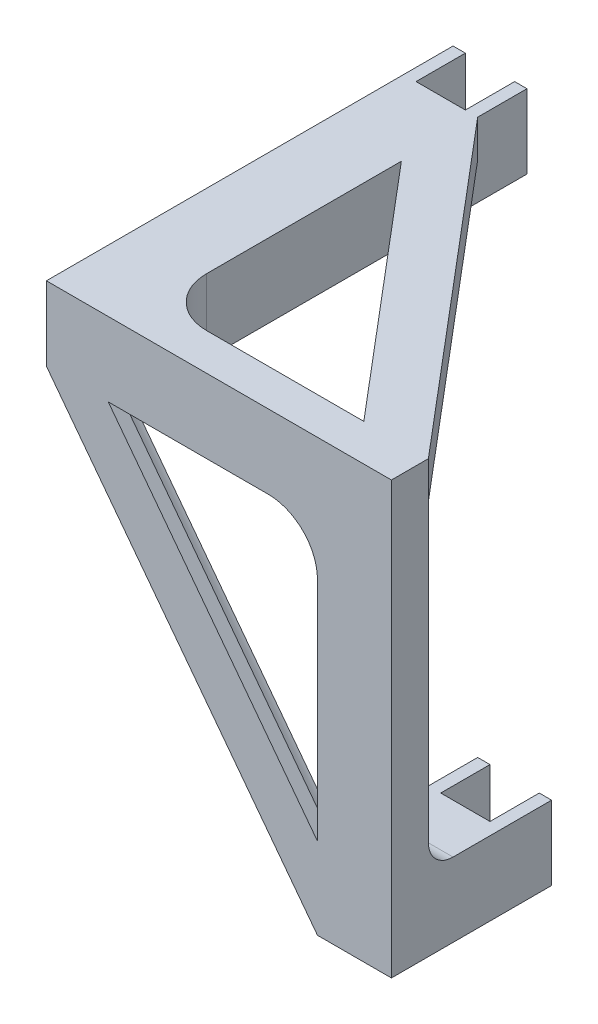
ISO-10303-21;
HEADER;
FILE_DESCRIPTION(('STEP AP214'),'2;1');
FILE_NAME('part.step','',(''),(''),'','','');
FILE_SCHEMA(('AUTOMOTIVE_DESIGN { 1 0 10303 214 1 1 1 1 }'));
ENDSEC;
DATA;
#1=APPLICATION_CONTEXT('core data for automotive mechanical design processes');
#2=APPLICATION_PROTOCOL_DEFINITION('international standard','automotive_design',2000,#1);
#3=PRODUCT_CONTEXT('',#1,'mechanical');
#4=PRODUCT('Part','Part','',(#3));
#5=PRODUCT_RELATED_PRODUCT_CATEGORY('part','',(#4));
#6=PRODUCT_DEFINITION_FORMATION('','',#4);
#7=PRODUCT_DEFINITION_CONTEXT('part definition',#1,'design');
#8=PRODUCT_DEFINITION('design','',#6,#7);
#9=PRODUCT_DEFINITION_SHAPE('','',#8);
#10=(LENGTH_UNIT() NAMED_UNIT(*) SI_UNIT(.MILLI.,.METRE.));
#11=(NAMED_UNIT(*) PLANE_ANGLE_UNIT() SI_UNIT($,.RADIAN.));
#12=(NAMED_UNIT(*) SI_UNIT($,.STERADIAN.) SOLID_ANGLE_UNIT());
#13=UNCERTAINTY_MEASURE_WITH_UNIT(LENGTH_MEASURE(1.E-05),#10,'distance_accuracy_value','');
#14=(GEOMETRIC_REPRESENTATION_CONTEXT(3) GLOBAL_UNCERTAINTY_ASSIGNED_CONTEXT((#13)) GLOBAL_UNIT_ASSIGNED_CONTEXT((#10,
#11,#12)) REPRESENTATION_CONTEXT('',''));
#15=CARTESIAN_POINT('',(0.,0.,0.));
#16=DIRECTION('',(0.,0.,1.));
#17=DIRECTION('',(1.,0.,0.));
#18=AXIS2_PLACEMENT_3D('',#15,#16,#17);
#19=CARTESIAN_POINT('',(-70.,57.5,0.));
#20=DIRECTION('',(0.,1.,0.));
#21=DIRECTION('',(0.,0.,1.));
#22=AXIS2_PLACEMENT_3D('',#19,#20,#21);
#23=PLANE('',#22);
#24=DIRECTION('',(-1.,0.,0.));
#25=VECTOR('',#24,1.);
#26=CARTESIAN_POINT('',(40.,57.5,165.));
#27=LINE('',#26,#25);
#28=CARTESIAN_POINT('',(20.,57.5,165.));
#29=VERTEX_POINT('',#28);
#30=CARTESIAN_POINT('',(-20.,57.5,165.));
#31=VERTEX_POINT('',#30);
#32=EDGE_CURVE('E299',#29,#31,#27,.T.);
#33=ORIENTED_EDGE('',*,*,#32,.F.);
#34=DIRECTION('',(0.,0.,1.));
#35=VECTOR('',#34,1.);
#36=CARTESIAN_POINT('',(20.,57.5,180.));
#37=LINE('',#36,#35);
#38=CARTESIAN_POINT('',(20.,57.5,180.));
#39=VERTEX_POINT('',#38);
#40=EDGE_CURVE('E268',#29,#39,#37,.T.);
#41=ORIENTED_EDGE('',*,*,#40,.T.);
#42=DIRECTION('',(-1.,0.,0.));
#43=VECTOR('',#42,1.);
#44=CARTESIAN_POINT('',(0.,57.5,180.));
#45=LINE('',#44,#43);
#46=CARTESIAN_POINT('',(-44.8961727955844,57.5,180.));
#47=VERTEX_POINT('',#46);
#48=EDGE_CURVE('E489',#39,#47,#45,.T.);
#49=ORIENTED_EDGE('',*,*,#48,.T.);
#50=DIRECTION('',(0.,0.,-1.));
#51=VECTOR('',#50,1.);
#52=CARTESIAN_POINT('',(-44.8961727955844,57.5,227.));
#53=LINE('',#52,#51);
#54=CARTESIAN_POINT('',(-44.8961727955844,57.5,175.));
#55=VERTEX_POINT('',#54);
#56=EDGE_CURVE('E518',#47,#55,#53,.T.);
#57=ORIENTED_EDGE('',*,*,#56,.T.);
#58=CARTESIAN_POINT('',(-44.8961727955844,57.5,165.));
#59=DIRECTION('',(0.,1.,0.));
#60=DIRECTION('',(-1.,0.,0.));
#61=AXIS2_PLACEMENT_3D('',#58,#59,#60);
#62=ELLIPSE('',#61,12.5519136022078,10.);
#63=CARTESIAN_POINT('',(-57.4480863977922,57.5,165.));
#64=VERTEX_POINT('',#63);
#65=EDGE_CURVE('E263',#55,#64,#62,.F.);
#66=ORIENTED_EDGE('',*,*,#65,.T.);
#67=DIRECTION('',(1.,0.,0.));
#68=VECTOR('',#67,1.);
#69=CARTESIAN_POINT('',(-70.,57.5,165.));
#70=LINE('',#69,#68);
#71=CARTESIAN_POINT('',(-70.,57.5,165.));
#72=VERTEX_POINT('',#71);
#73=EDGE_CURVE('E402',#72,#64,#70,.T.);
#74=ORIENTED_EDGE('',*,*,#73,.F.);
#75=DIRECTION('',(0.,0.,1.));
#76=VECTOR('',#75,1.);
#77=CARTESIAN_POINT('',(-70.,57.5,0.));
#78=LINE('',#77,#76);
#79=CARTESIAN_POINT('',(-70.,57.5,15.));
#80=VERTEX_POINT('',#79);
#81=EDGE_CURVE('E366',#80,#72,#78,.T.);
#82=ORIENTED_EDGE('',*,*,#81,.F.);
#83=DIRECTION('',(-1.,0.,0.));
#84=VECTOR('',#83,1.);
#85=CARTESIAN_POINT('',(-40.,57.5,15.));
#86=LINE('',#85,#84);
#87=CARTESIAN_POINT('',(-65.,57.5,15.));
#88=VERTEX_POINT('',#87);
#89=EDGE_CURVE('E452',#88,#80,#86,.T.);
#90=ORIENTED_EDGE('',*,*,#89,.F.);
#91=DIRECTION('',(0.,0.,-1.));
#92=VECTOR('',#91,1.);
#93=CARTESIAN_POINT('',(-65.,57.5,35.));
#94=LINE('',#93,#92);
#95=CARTESIAN_POINT('',(-65.,57.5,35.));
#96=VERTEX_POINT('',#95);
#97=EDGE_CURVE('E433',#96,#88,#94,.T.);
#98=ORIENTED_EDGE('',*,*,#97,.F.);
#99=DIRECTION('',(-1.,0.,0.));
#100=VECTOR('',#99,1.);
#101=CARTESIAN_POINT('',(-45.,57.5,35.));
#102=LINE('',#101,#100);
#103=CARTESIAN_POINT('',(-45.,57.5,35.));
#104=VERTEX_POINT('',#103);
#105=EDGE_CURVE('E428',#104,#96,#102,.T.);
#106=ORIENTED_EDGE('',*,*,#105,.F.);
#107=DIRECTION('',(0.,0.,-1.));
#108=VECTOR('',#107,1.);
#109=CARTESIAN_POINT('',(-45.,57.5,35.));
#110=LINE('',#109,#108);
#111=CARTESIAN_POINT('',(-45.,57.5,15.));
#112=VERTEX_POINT('',#111);
#113=EDGE_CURVE('E431',#104,#112,#110,.T.);
#114=ORIENTED_EDGE('',*,*,#113,.T.);
#115=CARTESIAN_POINT('',(-40.,57.5,15.));
#116=VERTEX_POINT('',#115);
#117=EDGE_CURVE('E304',#116,#112,#86,.T.);
#118=ORIENTED_EDGE('',*,*,#117,.F.);
#119=DIRECTION('',(0.,0.,-1.));
#120=VECTOR('',#119,1.);
#121=CARTESIAN_POINT('',(-40.,57.5,0.));
#122=LINE('',#121,#120);
#123=CARTESIAN_POINT('',(-40.,57.5,145.));
#124=VERTEX_POINT('',#123);
#125=EDGE_CURVE('E351',#124,#116,#122,.T.);
#126=ORIENTED_EDGE('',*,*,#125,.F.);
#127=CARTESIAN_POINT('',(-20.,57.5,145.));
#128=DIRECTION('',(0.,1.,0.));
#129=DIRECTION('',(0.,0.,1.));
#130=AXIS2_PLACEMENT_3D('',#127,#128,#129);
#131=CIRCLE('',#130,20.);
#132=EDGE_CURVE('E284',#124,#31,#131,.T.);
#133=ORIENTED_EDGE('',*,*,#132,.T.);
#134=EDGE_LOOP('',(#33,#41,#49,#57,#66,#74,#82,#90,#98,#106,#114,#118,#126,#133));
#135=FACE_BOUND('',#134,.T.);
#136=ADVANCED_FACE('F34',(#135),#23,.F.);
#137=CARTESIAN_POINT('',(40.,-87.5,0.));
#138=DIRECTION('',(1.,0.,0.));
#139=DIRECTION('',(0.,0.,-1.));
#140=AXIS2_PLACEMENT_3D('',#137,#138,#139);
#141=PLANE('',#140);
#142=DIRECTION('',(0.,1.,0.));
#143=VECTOR('',#142,1.);
#144=CARTESIAN_POINT('',(40.,0.,180.));
#145=LINE('',#144,#143);
#146=CARTESIAN_POINT('',(40.,-54.4085914123613,180.));
#147=VERTEX_POINT('',#146);
#148=CARTESIAN_POINT('',(40.,37.5,180.));
#149=VERTEX_POINT('',#148);
#150=EDGE_CURVE('E502',#147,#149,#145,.T.);
#151=ORIENTED_EDGE('',*,*,#150,.T.);
#152=DIRECTION('',(0.,0.,1.));
#153=VECTOR('',#152,1.);
#154=CARTESIAN_POINT('',(40.,37.5,165.));
#155=LINE('',#154,#153);
#156=CARTESIAN_POINT('',(40.,37.5,165.));
#157=VERTEX_POINT('',#156);
#158=EDGE_CURVE('E271',#149,#157,#155,.F.);
#159=ORIENTED_EDGE('',*,*,#158,.T.);
#160=DIRECTION('',(0.,1.,0.));
#161=VECTOR('',#160,1.);
#162=CARTESIAN_POINT('',(40.,-57.5,165.));
#163=LINE('',#162,#161);
#164=CARTESIAN_POINT('',(40.,-47.5,165.));
#165=VERTEX_POINT('',#164);
#166=EDGE_CURVE('E290',#165,#157,#163,.T.);
#167=ORIENTED_EDGE('',*,*,#166,.F.);
#168=CARTESIAN_POINT('',(40.,-47.5,155.));
#169=DIRECTION('',(1.,0.,0.));
#170=DIRECTION('',(0.,0.,-1.));
#171=AXIS2_PLACEMENT_3D('',#168,#169,#170);
#172=CIRCLE('',#171,10.);
#173=CARTESIAN_POINT('',(40.,-57.5,155.));
#174=VERTEX_POINT('',#173);
#175=EDGE_CURVE('E42',#165,#174,#172,.T.);
#176=ORIENTED_EDGE('',*,*,#175,.T.);
#177=DIRECTION('',(0.,0.,1.));
#178=VECTOR('',#177,1.);
#179=CARTESIAN_POINT('',(40.,-57.5,115.));
#180=LINE('',#179,#178);
#181=CARTESIAN_POINT('',(40.,-57.5,115.));
#182=VERTEX_POINT('',#181);
#183=EDGE_CURVE('E323',#182,#174,#180,.T.);
#184=ORIENTED_EDGE('',*,*,#183,.F.);
#185=DIRECTION('',(0.,1.,0.));
#186=VECTOR('',#185,1.);
#187=CARTESIAN_POINT('',(40.,57.5,115.));
#188=LINE('',#187,#186);
#189=CARTESIAN_POINT('',(40.,-87.5,115.));
#190=VERTEX_POINT('',#189);
#191=EDGE_CURVE('E355',#190,#182,#188,.T.);
#192=ORIENTED_EDGE('',*,*,#191,.F.);
#193=DIRECTION('',(0.,0.,1.));
#194=VECTOR('',#193,1.);
#195=CARTESIAN_POINT('',(40.,-87.5,0.));
#196=LINE('',#195,#194);
#197=CARTESIAN_POINT('',(40.,-87.5,165.));
#198=VERTEX_POINT('',#197);
#199=EDGE_CURVE('E365',#190,#198,#196,.T.);
#200=ORIENTED_EDGE('',*,*,#199,.T.);
#201=DIRECTION('',(0.,-1.,0.));
#202=VECTOR('',#201,1.);
#203=CARTESIAN_POINT('',(40.,-87.5,165.));
#204=LINE('',#203,#202);
#205=CARTESIAN_POINT('',(40.,-70.9542957061806,165.));
#206=VERTEX_POINT('',#205);
#207=EDGE_CURVE('E250',#206,#198,#204,.T.);
#208=ORIENTED_EDGE('',*,*,#207,.F.);
#209=CARTESIAN_POINT('',(40.,-54.4085914123613,165.));
#210=DIRECTION('',(1.,0.,0.));
#211=DIRECTION('',(0.,1.,0.));
#212=AXIS2_PLACEMENT_3D('',#209,#210,#211);
#213=ELLIPSE('',#212,16.5457042938194,10.);
#214=CARTESIAN_POINT('',(40.,-54.4085914123613,175.));
#215=VERTEX_POINT('',#214);
#216=EDGE_CURVE('E265',#206,#215,#213,.F.);
#217=ORIENTED_EDGE('',*,*,#216,.T.);
#218=DIRECTION('',(0.,0.,-1.));
#219=VECTOR('',#218,1.);
#220=CARTESIAN_POINT('',(40.,-54.4085914123613,227.));
#221=LINE('',#220,#219);
#222=EDGE_CURVE('E522',#147,#215,#221,.T.);
#223=ORIENTED_EDGE('',*,*,#222,.F.);
#224=EDGE_LOOP('',(#151,#159,#167,#176,#184,#192,#200,#208,#217,#223));
#225=FACE_BOUND('',#224,.T.);
#226=ADVANCED_FACE('F296',(#225),#141,.F.);
#227=CARTESIAN_POINT('',(0.,0.,165.));
#228=DIRECTION('',(0.,0.,-1.));
#229=DIRECTION('',(-1.,0.,0.));
#230=AXIS2_PLACEMENT_3D('',#227,#228,#229);
#231=PLANE('',#230);
#232=DIRECTION('',(0.,-1.,0.));
#233=VECTOR('',#232,1.);
#234=CARTESIAN_POINT('',(70.,87.5,165.));
#235=LINE('',#234,#233);
#236=CARTESIAN_POINT('',(70.,72.5,165.));
#237=VERTEX_POINT('',#236);
#238=CARTESIAN_POINT('',(70.,-47.5,165.));
#239=VERTEX_POINT('',#238);
#240=EDGE_CURVE('E292',#237,#239,#235,.T.);
#241=ORIENTED_EDGE('',*,*,#240,.T.);
#242=DIRECTION('',(-1.,0.,0.));
#243=VECTOR('',#242,1.);
#244=CARTESIAN_POINT('',(0.,-47.5,165.));
#245=LINE('',#244,#243);
#246=EDGE_CURVE('E286',#239,#165,#245,.T.);
#247=ORIENTED_EDGE('',*,*,#246,.T.);
#248=ORIENTED_EDGE('',*,*,#166,.T.);
#249=CARTESIAN_POINT('',(20.,37.5,165.));
#250=DIRECTION('',(0.,0.,-1.));
#251=DIRECTION('',(-1.,0.,0.));
#252=AXIS2_PLACEMENT_3D('',#249,#250,#251);
#253=CIRCLE('',#252,20.);
#254=EDGE_CURVE('E280',#157,#29,#253,.F.);
#255=ORIENTED_EDGE('',*,*,#254,.T.);
#256=ORIENTED_EDGE('',*,*,#32,.T.);
#257=DIRECTION('',(0.,1.,0.));
#258=VECTOR('',#257,1.);
#259=CARTESIAN_POINT('',(-20.,0.,165.));
#260=LINE('',#259,#258);
#261=CARTESIAN_POINT('',(-20.,87.5,165.));
#262=VERTEX_POINT('',#261);
#263=EDGE_CURVE('E274',#31,#262,#260,.T.);
#264=ORIENTED_EDGE('',*,*,#263,.T.);
#265=DIRECTION('',(-1.,0.,0.));
#266=VECTOR('',#265,1.);
#267=CARTESIAN_POINT('',(-70.,87.5,165.));
#268=LINE('',#267,#266);
#269=CARTESIAN_POINT('',(43.800944052421,87.5,165.));
#270=VERTEX_POINT('',#269);
#271=EDGE_CURVE('E236',#270,#262,#268,.T.);
#272=ORIENTED_EDGE('',*,*,#271,.F.);
#273=DIRECTION('',(0.,-1.,0.));
#274=VECTOR('',#273,1.);
#275=CARTESIAN_POINT('',(43.800944052421,134.5,165.));
#276=LINE('',#275,#274);
#277=CARTESIAN_POINT('',(43.800944052421,82.5,165.));
#278=VERTEX_POINT('',#277);
#279=EDGE_CURVE('E226',#270,#278,#276,.T.);
#280=ORIENTED_EDGE('',*,*,#279,.T.);
#281=CARTESIAN_POINT('',(43.8009440524209,72.5,165.));
#282=DIRECTION('',(0.,0.,-1.));
#283=DIRECTION('',(1.,0.,0.));
#284=AXIS2_PLACEMENT_3D('',#281,#282,#283);
#285=ELLIPSE('',#284,13.0995279737895,10.);
#286=CARTESIAN_POINT('',(56.9004720262105,72.5,165.));
#287=VERTEX_POINT('',#286);
#288=EDGE_CURVE('E232',#278,#287,#285,.T.);
#289=ORIENTED_EDGE('',*,*,#288,.T.);
#290=DIRECTION('',(1.,0.,0.));
#291=VECTOR('',#290,1.);
#292=CARTESIAN_POINT('',(0.,72.5,165.));
#293=LINE('',#292,#291);
#294=EDGE_CURVE('E510',#287,#237,#293,.T.);
#295=ORIENTED_EDGE('',*,*,#294,.T.);
#296=EDGE_LOOP('',(#241,#247,#248,#255,#256,#264,#272,#280,#289,#295));
#297=FACE_BOUND('',#296,.T.);
#298=ADVANCED_FACE('F229',(#297),#231,.T.);
#299=CARTESIAN_POINT('',(0.,0.,15.));
#300=DIRECTION('',(0.,0.,-1.));
#301=DIRECTION('',(-1.,0.,0.));
#302=AXIS2_PLACEMENT_3D('',#299,#300,#301);
#303=PLANE('',#302);
#304=DIRECTION('',(0.,1.,0.));
#305=VECTOR('',#304,1.);
#306=CARTESIAN_POINT('',(-65.,117.5,15.));
#307=LINE('',#306,#305);
#308=CARTESIAN_POINT('',(-65.,87.5,15.));
#309=VERTEX_POINT('',#308);
#310=EDGE_CURVE('E422',#88,#309,#307,.T.);
#311=ORIENTED_EDGE('',*,*,#310,.F.);
#312=ORIENTED_EDGE('',*,*,#89,.T.);
#313=DIRECTION('',(0.,1.,0.));
#314=VECTOR('',#313,1.);
#315=CARTESIAN_POINT('',(-70.,57.5,15.));
#316=LINE('',#315,#314);
#317=CARTESIAN_POINT('',(-70.,87.5,15.));
#318=VERTEX_POINT('',#317);
#319=EDGE_CURVE('E445',#80,#318,#316,.T.);
#320=ORIENTED_EDGE('',*,*,#319,.T.);
#321=DIRECTION('',(1.,0.,0.));
#322=VECTOR('',#321,1.);
#323=CARTESIAN_POINT('',(-70.,87.5,15.));
#324=LINE('',#323,#322);
#325=EDGE_CURVE('E448',#318,#309,#324,.T.);
#326=ORIENTED_EDGE('',*,*,#325,.T.);
#327=EDGE_LOOP('',(#311,#312,#320,#326));
#328=FACE_BOUND('',#327,.T.);
#329=ADVANCED_FACE('F563',(#328),#303,.T.);
#330=CARTESIAN_POINT('',(-70.,87.5,150.));
#331=DIRECTION('',(0.,-1.,0.));
#332=DIRECTION('',(0.,0.,-1.));
#333=AXIS2_PLACEMENT_3D('',#330,#331,#332);
#334=PLANE('',#333);
#335=DIRECTION('',(0.645942241466174,0.,0.763386285369115));
#336=VECTOR('',#335,1.);
#337=CARTESIAN_POINT('',(-11.0780705349685,87.5,100.142982760358));
#338=LINE('',#337,#336);
#339=CARTESIAN_POINT('',(-40.,87.5,65.9625206653207));
#340=VERTEX_POINT('',#339);
#341=EDGE_CURVE('E529',#340,#270,#338,.T.);
#342=ORIENTED_EDGE('',*,*,#341,.T.);
#343=ORIENTED_EDGE('',*,*,#271,.T.);
#344=CARTESIAN_POINT('',(-20.,87.5,145.));
#345=DIRECTION('',(0.,-1.,0.));
#346=DIRECTION('',(0.,0.,-1.));
#347=AXIS2_PLACEMENT_3D('',#344,#345,#346);
#348=CIRCLE('',#347,20.);
#349=CARTESIAN_POINT('',(-40.,87.5,145.));
#350=VERTEX_POINT('',#349);
#351=EDGE_CURVE('E282',#262,#350,#348,.T.);
#352=ORIENTED_EDGE('',*,*,#351,.T.);
#353=DIRECTION('',(0.,0.,-1.));
#354=VECTOR('',#353,1.);
#355=CARTESIAN_POINT('',(-40.,87.5,150.));
#356=LINE('',#355,#354);
#357=EDGE_CURVE('E240',#350,#340,#356,.T.);
#358=ORIENTED_EDGE('',*,*,#357,.T.);
#359=EDGE_LOOP('',(#342,#343,#352,#358));
#360=FACE_BOUND('',#359,.T.);
#361=DIRECTION('',(-0.645942241466174,0.,-0.763386285369115));
#362=VECTOR('',#361,1.);
#363=CARTESIAN_POINT('',(-40.,87.5,35.));
#364=LINE('',#363,#362);
#365=CARTESIAN_POINT('',(70.,87.5,165.));
#366=VERTEX_POINT('',#365);
#367=CARTESIAN_POINT('',(-40.,87.5,35.));
#368=VERTEX_POINT('',#367);
#369=EDGE_CURVE('E410',#366,#368,#364,.T.);
#370=ORIENTED_EDGE('',*,*,#369,.T.);
#371=DIRECTION('',(0.,0.,-1.));
#372=VECTOR('',#371,1.);
#373=CARTESIAN_POINT('',(-40.,87.5,150.));
#374=LINE('',#373,#372);
#375=CARTESIAN_POINT('',(-40.,87.5,15.));
#376=VERTEX_POINT('',#375);
#377=EDGE_CURVE('E353',#368,#376,#374,.T.);
#378=ORIENTED_EDGE('',*,*,#377,.T.);
#379=CARTESIAN_POINT('',(-45.,87.5,15.));
#380=VERTEX_POINT('',#379);
#381=EDGE_CURVE('E447',#380,#376,#324,.T.);
#382=ORIENTED_EDGE('',*,*,#381,.F.);
#383=DIRECTION('',(0.,0.,1.));
#384=VECTOR('',#383,1.);
#385=CARTESIAN_POINT('',(-45.,87.5,150.));
#386=LINE('',#385,#384);
#387=CARTESIAN_POINT('',(-45.,87.5,35.));
#388=VERTEX_POINT('',#387);
#389=EDGE_CURVE('E435',#380,#388,#386,.T.);
#390=ORIENTED_EDGE('',*,*,#389,.T.);
#391=DIRECTION('',(1.,0.,0.));
#392=VECTOR('',#391,1.);
#393=CARTESIAN_POINT('',(-70.,87.5,35.));
#394=LINE('',#393,#392);
#395=CARTESIAN_POINT('',(-65.,87.5,35.));
#396=VERTEX_POINT('',#395);
#397=EDGE_CURVE('E443',#396,#388,#394,.T.);
#398=ORIENTED_EDGE('',*,*,#397,.F.);
#399=DIRECTION('',(0.,0.,-1.));
#400=VECTOR('',#399,1.);
#401=CARTESIAN_POINT('',(-65.,87.5,150.));
#402=LINE('',#401,#400);
#403=EDGE_CURVE('E440',#396,#309,#402,.T.);
#404=ORIENTED_EDGE('',*,*,#403,.T.);
#405=ORIENTED_EDGE('',*,*,#325,.F.);
#406=DIRECTION('',(0.,0.,-1.));
#407=VECTOR('',#406,1.);
#408=CARTESIAN_POINT('',(-70.,87.5,150.));
#409=LINE('',#408,#407);
#410=CARTESIAN_POINT('',(-70.,87.5,180.));
#411=VERTEX_POINT('',#410);
#412=EDGE_CURVE('E374',#411,#318,#409,.T.);
#413=ORIENTED_EDGE('',*,*,#412,.F.);
#414=DIRECTION('',(-1.,0.,0.));
#415=VECTOR('',#414,1.);
#416=CARTESIAN_POINT('',(70.,87.5,180.));
#417=LINE('',#416,#415);
#418=CARTESIAN_POINT('',(70.,87.5,180.));
#419=VERTEX_POINT('',#418);
#420=EDGE_CURVE('E320',#419,#411,#417,.T.);
#421=ORIENTED_EDGE('',*,*,#420,.F.);
#422=DIRECTION('',(0.,0.,-1.));
#423=VECTOR('',#422,1.);
#424=CARTESIAN_POINT('',(70.,87.5,150.));
#425=LINE('',#424,#423);
#426=EDGE_CURVE('E377',#419,#366,#425,.T.);
#427=ORIENTED_EDGE('',*,*,#426,.T.);
#428=EDGE_LOOP('',(#370,#378,#382,#390,#398,#404,#405,#413,#421,#427));
#429=FACE_BOUND('',#428,.T.);
#430=ADVANCED_FACE('F477',(#360,#429),#334,.F.);
#431=CARTESIAN_POINT('',(-70.,87.5,150.));
#432=DIRECTION('',(1.,0.,0.));
#433=DIRECTION('',(0.,1.,0.));
#434=AXIS2_PLACEMENT_3D('',#431,#432,#433);
#435=PLANE('',#434);
#436=ORIENTED_EDGE('',*,*,#319,.F.);
#437=ORIENTED_EDGE('',*,*,#81,.T.);
#438=DIRECTION('',(0.,0.,1.));
#439=VECTOR('',#438,1.);
#440=CARTESIAN_POINT('',(-70.,57.5,175.));
#441=LINE('',#440,#439);
#442=CARTESIAN_POINT('',(-70.,57.5,180.));
#443=VERTEX_POINT('',#442);
#444=EDGE_CURVE('E401',#72,#443,#441,.T.);
#445=ORIENTED_EDGE('',*,*,#444,.T.);
#446=DIRECTION('',(0.,-1.,0.));
#447=VECTOR('',#446,1.);
#448=CARTESIAN_POINT('',(-70.,87.5,180.));
#449=LINE('',#448,#447);
#450=EDGE_CURVE('E310',#411,#443,#449,.T.);
#451=ORIENTED_EDGE('',*,*,#450,.F.);
#452=ORIENTED_EDGE('',*,*,#412,.T.);
#453=EDGE_LOOP('',(#436,#437,#445,#451,#452));
#454=FACE_BOUND('',#453,.T.);
#455=ADVANCED_FACE('F515',(#454),#435,.F.);
#456=CARTESIAN_POINT('',(-40.,207.5,0.));
#457=DIRECTION('',(-1.,0.,0.));
#458=DIRECTION('',(0.,0.,1.));
#459=AXIS2_PLACEMENT_3D('',#456,#457,#458);
#460=PLANE('',#459);
#461=ORIENTED_EDGE('',*,*,#357,.F.);
#462=DIRECTION('',(0.,1.,0.));
#463=VECTOR('',#462,1.);
#464=CARTESIAN_POINT('',(-40.,207.5,145.));
#465=LINE('',#464,#463);
#466=EDGE_CURVE('E276',#350,#124,#465,.F.);
#467=ORIENTED_EDGE('',*,*,#466,.T.);
#468=ORIENTED_EDGE('',*,*,#125,.T.);
#469=DIRECTION('',(0.,-1.,0.));
#470=VECTOR('',#469,1.);
#471=CARTESIAN_POINT('',(-40.,87.5,15.));
#472=LINE('',#471,#470);
#473=EDGE_CURVE('E450',#376,#116,#472,.T.);
#474=ORIENTED_EDGE('',*,*,#473,.F.);
#475=ORIENTED_EDGE('',*,*,#377,.F.);
#476=DIRECTION('',(0.,1.,0.));
#477=VECTOR('',#476,1.);
#478=CARTESIAN_POINT('',(-40.,82.5,35.));
#479=LINE('',#478,#477);
#480=CARTESIAN_POINT('',(-40.,72.5,35.));
#481=VERTEX_POINT('',#480);
#482=EDGE_CURVE('E413',#481,#368,#479,.T.);
#483=ORIENTED_EDGE('',*,*,#482,.F.);
#484=DIRECTION('',(0.,0.,-1.));
#485=VECTOR('',#484,1.);
#486=CARTESIAN_POINT('',(-40.,72.5,0.));
#487=LINE('',#486,#485);
#488=CARTESIAN_POINT('',(-40.,72.5,50.4812603326604));
#489=VERTEX_POINT('',#488);
#490=EDGE_CURVE('E507',#489,#481,#487,.T.);
#491=ORIENTED_EDGE('',*,*,#490,.F.);
#492=CARTESIAN_POINT('',(-40.,72.5,65.9625206653207));
#493=DIRECTION('',(-1.,0.,0.));
#494=DIRECTION('',(0.,0.,1.));
#495=AXIS2_PLACEMENT_3D('',#492,#493,#494);
#496=ELLIPSE('',#495,15.4812603326604,10.);
#497=CARTESIAN_POINT('',(-40.,82.5,65.9625206653207));
#498=VERTEX_POINT('',#497);
#499=EDGE_CURVE('E255',#489,#498,#496,.F.);
#500=ORIENTED_EDGE('',*,*,#499,.T.);
#501=DIRECTION('',(0.,-1.,0.));
#502=VECTOR('',#501,1.);
#503=CARTESIAN_POINT('',(-40.,134.5,65.9625206653207));
#504=LINE('',#503,#502);
#505=EDGE_CURVE('E241',#340,#498,#504,.T.);
#506=ORIENTED_EDGE('',*,*,#505,.F.);
#507=EDGE_LOOP('',(#461,#467,#468,#474,#475,#483,#491,#500,#506));
#508=FACE_BOUND('',#507,.T.);
#509=ADVANCED_FACE('F480',(#508),#460,.F.);
#510=CARTESIAN_POINT('',(190.,57.5,115.));
#511=DIRECTION('',(0.,0.,1.));
#512=DIRECTION('',(0.,-1.,0.));
#513=AXIS2_PLACEMENT_3D('',#510,#511,#512);
#514=PLANE('',#513);
#515=ORIENTED_EDGE('',*,*,#191,.T.);
#516=DIRECTION('',(-1.,0.,0.));
#517=VECTOR('',#516,1.);
#518=CARTESIAN_POINT('',(190.,-57.5,115.));
#519=LINE('',#518,#517);
#520=CARTESIAN_POINT('',(45.,-57.5,115.));
#521=VERTEX_POINT('',#520);
#522=EDGE_CURVE('E325',#521,#182,#519,.T.);
#523=ORIENTED_EDGE('',*,*,#522,.F.);
#524=DIRECTION('',(0.,-1.,0.));
#525=VECTOR('',#524,1.);
#526=CARTESIAN_POINT('',(45.,57.5,115.));
#527=LINE('',#526,#525);
#528=CARTESIAN_POINT('',(45.,-87.5,115.));
#529=VERTEX_POINT('',#528);
#530=EDGE_CURVE('E349',#521,#529,#527,.T.);
#531=ORIENTED_EDGE('',*,*,#530,.T.);
#532=DIRECTION('',(-1.,0.,0.));
#533=VECTOR('',#532,1.);
#534=CARTESIAN_POINT('',(190.,-87.5,115.));
#535=LINE('',#534,#533);
#536=EDGE_CURVE('E358',#529,#190,#535,.T.);
#537=ORIENTED_EDGE('',*,*,#536,.T.);
#538=EDGE_LOOP('',(#515,#523,#531,#537));
#539=FACE_BOUND('',#538,.T.);
#540=ADVANCED_FACE('F566',(#539),#514,.F.);
#541=CARTESIAN_POINT('',(70.,87.5,150.));
#542=DIRECTION('',(-1.,0.,0.));
#543=DIRECTION('',(0.,-1.,0.));
#544=AXIS2_PLACEMENT_3D('',#541,#542,#543);
#545=PLANE('',#544);
#546=DIRECTION('',(0.,0.,1.));
#547=VECTOR('',#546,1.);
#548=CARTESIAN_POINT('',(70.,-57.5,150.));
#549=LINE('',#548,#547);
#550=CARTESIAN_POINT('',(70.,-57.5,115.));
#551=VERTEX_POINT('',#550);
#552=CARTESIAN_POINT('',(70.,-57.5,155.));
#553=VERTEX_POINT('',#552);
#554=EDGE_CURVE('E331',#551,#553,#549,.T.);
#555=ORIENTED_EDGE('',*,*,#554,.T.);
#556=CARTESIAN_POINT('',(70.,-47.5,155.));
#557=DIRECTION('',(-1.,0.,0.));
#558=DIRECTION('',(0.,-1.,0.));
#559=AXIS2_PLACEMENT_3D('',#556,#557,#558);
#560=CIRCLE('',#559,10.);
#561=EDGE_CURVE('E11',#553,#239,#560,.T.);
#562=ORIENTED_EDGE('',*,*,#561,.T.);
#563=ORIENTED_EDGE('',*,*,#240,.F.);
#564=EDGE_CURVE('E309',#366,#237,#235,.T.);
#565=ORIENTED_EDGE('',*,*,#564,.F.);
#566=ORIENTED_EDGE('',*,*,#426,.F.);
#567=DIRECTION('',(0.,1.,0.));
#568=VECTOR('',#567,1.);
#569=CARTESIAN_POINT('',(70.,-87.5,180.));
#570=LINE('',#569,#568);
#571=CARTESIAN_POINT('',(70.,-87.5,180.));
#572=VERTEX_POINT('',#571);
#573=EDGE_CURVE('E317',#572,#419,#570,.T.);
#574=ORIENTED_EDGE('',*,*,#573,.F.);
#575=DIRECTION('',(0.,0.,-1.));
#576=VECTOR('',#575,1.);
#577=CARTESIAN_POINT('',(70.,-87.5,150.));
#578=LINE('',#577,#576);
#579=CARTESIAN_POINT('',(70.,-87.5,115.));
#580=VERTEX_POINT('',#579);
#581=EDGE_CURVE('E369',#572,#580,#578,.T.);
#582=ORIENTED_EDGE('',*,*,#581,.T.);
#583=DIRECTION('',(0.,1.,0.));
#584=VECTOR('',#583,1.);
#585=CARTESIAN_POINT('',(70.,87.5,115.));
#586=LINE('',#585,#584);
#587=EDGE_CURVE('E362',#580,#551,#586,.T.);
#588=ORIENTED_EDGE('',*,*,#587,.T.);
#589=EDGE_LOOP('',(#555,#562,#563,#565,#566,#574,#582,#588));
#590=FACE_BOUND('',#589,.T.);
#591=ADVANCED_FACE('F542',(#590),#545,.F.);
#592=CARTESIAN_POINT('',(-70.,-87.5,150.));
#593=DIRECTION('',(0.,1.,0.));
#594=DIRECTION('',(0.,0.,1.));
#595=AXIS2_PLACEMENT_3D('',#592,#593,#594);
#596=PLANE('',#595);
#597=ORIENTED_EDGE('',*,*,#536,.F.);
#598=DIRECTION('',(0.,0.,-1.));
#599=VECTOR('',#598,1.);
#600=CARTESIAN_POINT('',(45.,-87.5,95.));
#601=LINE('',#600,#599);
#602=CARTESIAN_POINT('',(45.,-87.5,135.));
#603=VERTEX_POINT('',#602);
#604=EDGE_CURVE('E333',#603,#529,#601,.T.);
#605=ORIENTED_EDGE('',*,*,#604,.F.);
#606=DIRECTION('',(-1.,0.,0.));
#607=VECTOR('',#606,1.);
#608=CARTESIAN_POINT('',(65.,-87.5,135.));
#609=LINE('',#608,#607);
#610=CARTESIAN_POINT('',(65.,-87.5,135.));
#611=VERTEX_POINT('',#610);
#612=EDGE_CURVE('E339',#611,#603,#609,.T.);
#613=ORIENTED_EDGE('',*,*,#612,.F.);
#614=DIRECTION('',(0.,0.,1.));
#615=VECTOR('',#614,1.);
#616=CARTESIAN_POINT('',(65.,-87.5,95.));
#617=LINE('',#616,#615);
#618=CARTESIAN_POINT('',(65.,-87.5,115.));
#619=VERTEX_POINT('',#618);
#620=EDGE_CURVE('E336',#619,#611,#617,.T.);
#621=ORIENTED_EDGE('',*,*,#620,.F.);
#622=EDGE_CURVE('E359',#580,#619,#535,.T.);
#623=ORIENTED_EDGE('',*,*,#622,.F.);
#624=ORIENTED_EDGE('',*,*,#581,.F.);
#625=DIRECTION('',(1.,0.,0.));
#626=VECTOR('',#625,1.);
#627=CARTESIAN_POINT('',(40.,-87.5,180.));
#628=LINE('',#627,#626);
#629=CARTESIAN_POINT('',(40.,-87.5,180.));
#630=VERTEX_POINT('',#629);
#631=EDGE_CURVE('E314',#630,#572,#628,.T.);
#632=ORIENTED_EDGE('',*,*,#631,.F.);
#633=DIRECTION('',(0.,0.,1.));
#634=VECTOR('',#633,1.);
#635=CARTESIAN_POINT('',(40.,-87.5,175.));
#636=LINE('',#635,#634);
#637=EDGE_CURVE('E398',#198,#630,#636,.T.);
#638=ORIENTED_EDGE('',*,*,#637,.F.);
#639=ORIENTED_EDGE('',*,*,#199,.F.);
#640=EDGE_LOOP('',(#597,#605,#613,#621,#623,#624,#632,#638,#639));
#641=FACE_BOUND('',#640,.T.);
#642=ADVANCED_FACE('F408',(#641),#596,.F.);
#643=DIRECTION('',(0.,1.,0.));
#644=VECTOR('',#643,1.);
#645=CARTESIAN_POINT('',(65.,57.5,115.));
#646=LINE('',#645,#644);
#647=CARTESIAN_POINT('',(65.,-57.5,115.));
#648=VERTEX_POINT('',#647);
#649=EDGE_CURVE('E345',#619,#648,#646,.T.);
#650=ORIENTED_EDGE('',*,*,#649,.T.);
#651=EDGE_CURVE('E327',#551,#648,#519,.T.);
#652=ORIENTED_EDGE('',*,*,#651,.F.);
#653=ORIENTED_EDGE('',*,*,#587,.F.);
#654=ORIENTED_EDGE('',*,*,#622,.T.);
#655=EDGE_LOOP('',(#650,#652,#653,#654));
#656=FACE_BOUND('',#655,.T.);
#657=ADVANCED_FACE('F554',(#656),#514,.F.);
#658=CARTESIAN_POINT('',(70.,207.5,135.));
#659=DIRECTION('',(0.,0.,1.));
#660=DIRECTION('',(1.,0.,0.));
#661=AXIS2_PLACEMENT_3D('',#658,#659,#660);
#662=PLANE('',#661);
#663=DIRECTION('',(0.,-1.,0.));
#664=VECTOR('',#663,1.);
#665=CARTESIAN_POINT('',(45.,62.5,135.));
#666=LINE('',#665,#664);
#667=CARTESIAN_POINT('',(45.,-57.5,135.));
#668=VERTEX_POINT('',#667);
#669=EDGE_CURVE('E343',#668,#603,#666,.T.);
#670=ORIENTED_EDGE('',*,*,#669,.F.);
#671=DIRECTION('',(-1.,0.,0.));
#672=VECTOR('',#671,1.);
#673=CARTESIAN_POINT('',(65.,-57.5,135.));
#674=LINE('',#673,#672);
#675=CARTESIAN_POINT('',(65.,-57.5,135.));
#676=VERTEX_POINT('',#675);
#677=EDGE_CURVE('E300',#676,#668,#674,.T.);
#678=ORIENTED_EDGE('',*,*,#677,.F.);
#679=DIRECTION('',(0.,-1.,0.));
#680=VECTOR('',#679,1.);
#681=CARTESIAN_POINT('',(65.,62.5,135.));
#682=LINE('',#681,#680);
#683=EDGE_CURVE('E342',#676,#611,#682,.T.);
#684=ORIENTED_EDGE('',*,*,#683,.T.);
#685=ORIENTED_EDGE('',*,*,#612,.T.);
#686=EDGE_LOOP('',(#670,#678,#684,#685));
#687=FACE_BOUND('',#686,.T.);
#688=ADVANCED_FACE('F615',(#687),#662,.F.);
#689=CARTESIAN_POINT('',(45.,62.5,95.));
#690=DIRECTION('',(-1.,0.,0.));
#691=DIRECTION('',(0.,0.,1.));
#692=AXIS2_PLACEMENT_3D('',#689,#690,#691);
#693=PLANE('',#692);
#694=ORIENTED_EDGE('',*,*,#530,.F.);
#695=DIRECTION('',(0.,0.,1.));
#696=VECTOR('',#695,1.);
#697=CARTESIAN_POINT('',(45.,-57.5,95.));
#698=LINE('',#697,#696);
#699=EDGE_CURVE('E328',#521,#668,#698,.T.);
#700=ORIENTED_EDGE('',*,*,#699,.T.);
#701=ORIENTED_EDGE('',*,*,#669,.T.);
#702=ORIENTED_EDGE('',*,*,#604,.T.);
#703=EDGE_LOOP('',(#694,#700,#701,#702));
#704=FACE_BOUND('',#703,.T.);
#705=ADVANCED_FACE('F611',(#704),#693,.F.);
#706=CARTESIAN_POINT('',(65.,62.5,95.));
#707=DIRECTION('',(1.,0.,0.));
#708=DIRECTION('',(0.,0.,-1.));
#709=AXIS2_PLACEMENT_3D('',#706,#707,#708);
#710=PLANE('',#709);
#711=ORIENTED_EDGE('',*,*,#683,.F.);
#712=DIRECTION('',(0.,0.,-1.));
#713=VECTOR('',#712,1.);
#714=CARTESIAN_POINT('',(65.,-57.5,95.));
#715=LINE('',#714,#713);
#716=EDGE_CURVE('E379',#676,#648,#715,.T.);
#717=ORIENTED_EDGE('',*,*,#716,.T.);
#718=ORIENTED_EDGE('',*,*,#649,.F.);
#719=ORIENTED_EDGE('',*,*,#620,.T.);
#720=EDGE_LOOP('',(#711,#717,#718,#719));
#721=FACE_BOUND('',#720,.T.);
#722=ADVANCED_FACE('F608',(#721),#710,.F.);
#723=CARTESIAN_POINT('',(190.,-57.5,115.));
#724=DIRECTION('',(0.,-1.,0.));
#725=DIRECTION('',(0.,0.,-1.));
#726=AXIS2_PLACEMENT_3D('',#723,#724,#725);
#727=PLANE('',#726);
#728=ORIENTED_EDGE('',*,*,#183,.T.);
#729=DIRECTION('',(-1.,0.,0.));
#730=VECTOR('',#729,1.);
#731=CARTESIAN_POINT('',(190.,-57.5,155.));
#732=LINE('',#731,#730);
#733=EDGE_CURVE('E49',#174,#553,#732,.F.);
#734=ORIENTED_EDGE('',*,*,#733,.T.);
#735=ORIENTED_EDGE('',*,*,#554,.F.);
#736=ORIENTED_EDGE('',*,*,#651,.T.);
#737=ORIENTED_EDGE('',*,*,#716,.F.);
#738=ORIENTED_EDGE('',*,*,#677,.T.);
#739=ORIENTED_EDGE('',*,*,#699,.F.);
#740=ORIENTED_EDGE('',*,*,#522,.T.);
#741=EDGE_LOOP('',(#728,#734,#735,#736,#737,#738,#739,#740));
#742=FACE_BOUND('',#741,.T.);
#743=ADVANCED_FACE('F605',(#742),#727,.F.);
#744=CARTESIAN_POINT('',(0.,0.,180.));
#745=DIRECTION('',(0.,0.,1.));
#746=DIRECTION('',(1.,0.,0.));
#747=AXIS2_PLACEMENT_3D('',#744,#745,#746);
#748=PLANE('',#747);
#749=ORIENTED_EDGE('',*,*,#48,.F.);
#750=CARTESIAN_POINT('',(20.,37.5,180.));
#751=DIRECTION('',(0.,0.,1.));
#752=DIRECTION('',(1.,0.,0.));
#753=AXIS2_PLACEMENT_3D('',#750,#751,#752);
#754=CIRCLE('',#753,20.);
#755=EDGE_CURVE('E278',#39,#149,#754,.F.);
#756=ORIENTED_EDGE('',*,*,#755,.T.);
#757=ORIENTED_EDGE('',*,*,#150,.F.);
#758=DIRECTION('',(0.604386481374232,-0.796691270902396,0.));
#759=VECTOR('',#758,1.);
#760=CARTESIAN_POINT('',(-0.80957080836716,-0.61415716496819,180.));
#761=LINE('',#760,#759);
#762=EDGE_CURVE('E497',#47,#147,#761,.T.);
#763=ORIENTED_EDGE('',*,*,#762,.F.);
#764=EDGE_LOOP('',(#749,#756,#757,#763));
#765=FACE_BOUND('',#764,.T.);
#766=ORIENTED_EDGE('',*,*,#450,.T.);
#767=DIRECTION('',(0.604386481374232,-0.796691270902396,0.));
#768=VECTOR('',#767,1.);
#769=CARTESIAN_POINT('',(-70.,57.5,180.));
#770=LINE('',#769,#768);
#771=EDGE_CURVE('E415',#443,#630,#770,.T.);
#772=ORIENTED_EDGE('',*,*,#771,.T.);
#773=ORIENTED_EDGE('',*,*,#631,.T.);
#774=ORIENTED_EDGE('',*,*,#573,.T.);
#775=ORIENTED_EDGE('',*,*,#420,.T.);
#776=EDGE_LOOP('',(#766,#772,#773,#774,#775));
#777=FACE_BOUND('',#776,.T.);
#778=ADVANCED_FACE('F493',(#765,#777),#748,.T.);
#779=DIRECTION('',(0.,-1.,0.));
#780=VECTOR('',#779,1.);
#781=CARTESIAN_POINT('',(-45.,0.,15.));
#782=LINE('',#781,#780);
#783=EDGE_CURVE('E382',#380,#112,#782,.T.);
#784=ORIENTED_EDGE('',*,*,#783,.F.);
#785=ORIENTED_EDGE('',*,*,#381,.T.);
#786=ORIENTED_EDGE('',*,*,#473,.T.);
#787=ORIENTED_EDGE('',*,*,#117,.T.);
#788=EDGE_LOOP('',(#784,#785,#786,#787));
#789=FACE_BOUND('',#788,.T.);
#790=ADVANCED_FACE('F463',(#789),#303,.T.);
#791=CARTESIAN_POINT('',(0.,0.,35.));
#792=DIRECTION('',(0.,0.,-1.));
#793=DIRECTION('',(-1.,0.,0.));
#794=AXIS2_PLACEMENT_3D('',#791,#792,#793);
#795=PLANE('',#794);
#796=ORIENTED_EDGE('',*,*,#397,.T.);
#797=DIRECTION('',(0.,-1.,0.));
#798=VECTOR('',#797,1.);
#799=CARTESIAN_POINT('',(-45.,117.5,35.));
#800=LINE('',#799,#798);
#801=EDGE_CURVE('E426',#388,#104,#800,.T.);
#802=ORIENTED_EDGE('',*,*,#801,.T.);
#803=ORIENTED_EDGE('',*,*,#105,.T.);
#804=DIRECTION('',(0.,1.,0.));
#805=VECTOR('',#804,1.);
#806=CARTESIAN_POINT('',(-65.,117.5,35.));
#807=LINE('',#806,#805);
#808=EDGE_CURVE('E423',#96,#396,#807,.T.);
#809=ORIENTED_EDGE('',*,*,#808,.T.);
#810=EDGE_LOOP('',(#796,#802,#803,#809));
#811=FACE_BOUND('',#810,.T.);
#812=ADVANCED_FACE('F589',(#811),#795,.T.);
#813=CARTESIAN_POINT('',(-65.,117.5,35.));
#814=DIRECTION('',(-1.,0.,0.));
#815=DIRECTION('',(0.,-1.,0.));
#816=AXIS2_PLACEMENT_3D('',#813,#814,#815);
#817=PLANE('',#816);
#818=ORIENTED_EDGE('',*,*,#808,.F.);
#819=ORIENTED_EDGE('',*,*,#97,.T.);
#820=ORIENTED_EDGE('',*,*,#310,.T.);
#821=ORIENTED_EDGE('',*,*,#403,.F.);
#822=EDGE_LOOP('',(#818,#819,#820,#821));
#823=FACE_BOUND('',#822,.T.);
#824=ADVANCED_FACE('F592',(#823),#817,.F.);
#825=CARTESIAN_POINT('',(-45.,117.5,35.));
#826=DIRECTION('',(1.,0.,0.));
#827=DIRECTION('',(0.,1.,0.));
#828=AXIS2_PLACEMENT_3D('',#825,#826,#827);
#829=PLANE('',#828);
#830=ORIENTED_EDGE('',*,*,#783,.T.);
#831=ORIENTED_EDGE('',*,*,#113,.F.);
#832=ORIENTED_EDGE('',*,*,#801,.F.);
#833=ORIENTED_EDGE('',*,*,#389,.F.);
#834=EDGE_LOOP('',(#830,#831,#832,#833));
#835=FACE_BOUND('',#834,.T.);
#836=ADVANCED_FACE('F474',(#835),#829,.F.);
#837=CARTESIAN_POINT('',(-40.,82.5,35.));
#838=DIRECTION('',(0.763386285369115,0.,-0.645942241466174));
#839=DIRECTION('',(-0.645942241466174,0.,-0.763386285369115));
#840=AXIS2_PLACEMENT_3D('',#837,#838,#839);
#841=PLANE('',#840);
#842=ORIENTED_EDGE('',*,*,#369,.F.);
#843=ORIENTED_EDGE('',*,*,#564,.T.);
#844=DIRECTION('',(0.645942241466174,0.,0.763386285369115));
#845=VECTOR('',#844,1.);
#846=CARTESIAN_POINT('',(-40.,72.5,35.));
#847=LINE('',#846,#845);
#848=EDGE_CURVE('E498',#481,#237,#847,.T.);
#849=ORIENTED_EDGE('',*,*,#848,.F.);
#850=ORIENTED_EDGE('',*,*,#482,.T.);
#851=EDGE_LOOP('',(#842,#843,#849,#850));
#852=FACE_BOUND('',#851,.T.);
#853=ADVANCED_FACE('F539',(#852),#841,.T.);
#854=CARTESIAN_POINT('',(-70.,57.5,175.));
#855=DIRECTION('',(-0.796691270902396,-0.604386481374232,0.));
#856=DIRECTION('',(0.604386481374232,-0.796691270902396,0.));
#857=AXIS2_PLACEMENT_3D('',#854,#855,#856);
#858=PLANE('',#857);
#859=ORIENTED_EDGE('',*,*,#771,.F.);
#860=ORIENTED_EDGE('',*,*,#444,.F.);
#861=DIRECTION('',(0.604386481374232,-0.796691270902396,0.));
#862=VECTOR('',#861,1.);
#863=CARTESIAN_POINT('',(-70.,57.5,165.));
#864=LINE('',#863,#862);
#865=EDGE_CURVE('E390',#72,#198,#864,.T.);
#866=ORIENTED_EDGE('',*,*,#865,.T.);
#867=ORIENTED_EDGE('',*,*,#637,.T.);
#868=EDGE_LOOP('',(#859,#860,#866,#867));
#869=FACE_BOUND('',#868,.T.);
#870=ADVANCED_FACE('F397',(#869),#858,.T.);
#871=CARTESIAN_POINT('',(0.,0.,165.));
#872=DIRECTION('',(0.,0.,1.));
#873=DIRECTION('',(1.,0.,0.));
#874=AXIS2_PLACEMENT_3D('',#871,#872,#873);
#875=PLANE('',#874);
#876=ORIENTED_EDGE('',*,*,#865,.F.);
#877=ORIENTED_EDGE('',*,*,#73,.T.);
#878=DIRECTION('',(0.604386481374232,-0.796691270902396,0.));
#879=VECTOR('',#878,1.);
#880=CARTESIAN_POINT('',(-62.033087290976,63.5438648137423,165.));
#881=LINE('',#880,#879);
#882=EDGE_CURVE('E393',#64,#206,#881,.T.);
#883=ORIENTED_EDGE('',*,*,#882,.T.);
#884=ORIENTED_EDGE('',*,*,#207,.T.);
#885=EDGE_LOOP('',(#876,#877,#883,#884));
#886=FACE_BOUND('',#885,.T.);
#887=ADVANCED_FACE('F388',(#886),#875,.F.);
#888=CARTESIAN_POINT('',(0.,72.5,0.));
#889=DIRECTION('',(0.,1.,0.));
#890=DIRECTION('',(-1.,0.,0.));
#891=AXIS2_PLACEMENT_3D('',#888,#889,#890);
#892=PLANE('',#891);
#893=ORIENTED_EDGE('',*,*,#294,.F.);
#894=DIRECTION('',(0.645942241466174,0.,0.763386285369115));
#895=VECTOR('',#894,1.);
#896=CARTESIAN_POINT('',(-47.6338628536911,72.5,41.4594224146617));
#897=LINE('',#896,#895);
#898=EDGE_CURVE('E254',#489,#287,#897,.T.);
#899=ORIENTED_EDGE('',*,*,#898,.F.);
#900=ORIENTED_EDGE('',*,*,#490,.T.);
#901=ORIENTED_EDGE('',*,*,#848,.T.);
#902=EDGE_LOOP('',(#893,#899,#900,#901));
#903=FACE_BOUND('',#902,.T.);
#904=ADVANCED_FACE('F536',(#903),#892,.F.);
#905=CARTESIAN_POINT('',(-55.8366912246237,72.5,47.24643103622));
#906=DIRECTION('',(0.645942241466174,0.,0.763386285369115));
#907=DIRECTION('',(0.763386285369115,0.,-0.645942241466174));
#908=AXIS2_PLACEMENT_3D('',#905,#906,#907);
#909=CYLINDRICAL_SURFACE('',#908,10.);
#910=ORIENTED_EDGE('',*,*,#499,.F.);
#911=ORIENTED_EDGE('',*,*,#898,.T.);
#912=ORIENTED_EDGE('',*,*,#288,.F.);
#913=DIRECTION('',(0.645942241466174,0.,0.763386285369115));
#914=VECTOR('',#913,1.);
#915=CARTESIAN_POINT('',(-55.8366912246237,82.5,47.24643103622));
#916=LINE('',#915,#914);
#917=EDGE_CURVE('E244',#498,#278,#916,.T.);
#918=ORIENTED_EDGE('',*,*,#917,.F.);
#919=EDGE_LOOP('',(#910,#911,#912,#918));
#920=FACE_BOUND('',#919,.T.);
#921=ADVANCED_FACE('F253',(#920),#909,.F.);
#922=CARTESIAN_POINT('',(-0.80957080836716,-0.61415716496819,165.));
#923=DIRECTION('',(-0.604386481374232,0.796691270902396,0.));
#924=DIRECTION('',(-0.796691270902396,-0.604386481374232,0.));
#925=AXIS2_PLACEMENT_3D('',#922,#923,#924);
#926=CYLINDRICAL_SURFACE('',#925,10.);
#927=ORIENTED_EDGE('',*,*,#216,.F.);
#928=ORIENTED_EDGE('',*,*,#882,.F.);
#929=ORIENTED_EDGE('',*,*,#65,.F.);
#930=DIRECTION('',(-0.604386481374232,0.796691270902396,0.));
#931=VECTOR('',#930,1.);
#932=CARTESIAN_POINT('',(-0.80957080836716,-0.61415716496819,175.));
#933=LINE('',#932,#931);
#934=EDGE_CURVE('E257',#215,#55,#933,.T.);
#935=ORIENTED_EDGE('',*,*,#934,.F.);
#936=EDGE_LOOP('',(#927,#928,#929,#935));
#937=FACE_BOUND('',#936,.T.);
#938=ADVANCED_FACE('F521',(#937),#926,.F.);
#939=CARTESIAN_POINT('',(40.,-54.4085914123613,227.));
#940=DIRECTION('',(-0.796691270902396,-0.604386481374232,0.));
#941=DIRECTION('',(0.604386481374232,-0.796691270902396,0.));
#942=AXIS2_PLACEMENT_3D('',#939,#940,#941);
#943=PLANE('',#942);
#944=ORIENTED_EDGE('',*,*,#762,.T.);
#945=ORIENTED_EDGE('',*,*,#222,.T.);
#946=ORIENTED_EDGE('',*,*,#934,.T.);
#947=ORIENTED_EDGE('',*,*,#56,.F.);
#948=EDGE_LOOP('',(#944,#945,#946,#947));
#949=FACE_BOUND('',#948,.T.);
#950=ADVANCED_FACE('F525',(#949),#943,.F.);
#951=CARTESIAN_POINT('',(-40.,134.5,65.9625206653207));
#952=DIRECTION('',(0.763386285369115,0.,-0.645942241466174));
#953=DIRECTION('',(-0.645942241466174,0.,-0.763386285369115));
#954=AXIS2_PLACEMENT_3D('',#951,#952,#953);
#955=PLANE('',#954);
#956=ORIENTED_EDGE('',*,*,#505,.T.);
#957=ORIENTED_EDGE('',*,*,#917,.T.);
#958=ORIENTED_EDGE('',*,*,#279,.F.);
#959=ORIENTED_EDGE('',*,*,#341,.F.);
#960=EDGE_LOOP('',(#956,#957,#958,#959));
#961=FACE_BOUND('',#960,.T.);
#962=ADVANCED_FACE('F245',(#961),#955,.F.);
#963=CARTESIAN_POINT('',(20.,37.5,0.));
#964=DIRECTION('',(0.,0.,-1.));
#965=DIRECTION('',(-1.,0.,0.));
#966=AXIS2_PLACEMENT_3D('',#963,#964,#965);
#967=CYLINDRICAL_SURFACE('',#966,20.);
#968=ORIENTED_EDGE('',*,*,#254,.F.);
#969=ORIENTED_EDGE('',*,*,#158,.F.);
#970=ORIENTED_EDGE('',*,*,#755,.F.);
#971=ORIENTED_EDGE('',*,*,#40,.F.);
#972=EDGE_LOOP('',(#968,#969,#970,#971));
#973=FACE_BOUND('',#972,.T.);
#974=ADVANCED_FACE('F487',(#973),#967,.F.);
#975=CARTESIAN_POINT('',(-20.,0.,145.));
#976=DIRECTION('',(0.,1.,0.));
#977=DIRECTION('',(0.,0.,1.));
#978=AXIS2_PLACEMENT_3D('',#975,#976,#977);
#979=CYLINDRICAL_SURFACE('',#978,20.);
#980=ORIENTED_EDGE('',*,*,#132,.F.);
#981=ORIENTED_EDGE('',*,*,#466,.F.);
#982=ORIENTED_EDGE('',*,*,#351,.F.);
#983=ORIENTED_EDGE('',*,*,#263,.F.);
#984=EDGE_LOOP('',(#980,#981,#982,#983));
#985=FACE_BOUND('',#984,.T.);
#986=ADVANCED_FACE('F483',(#985),#979,.F.);
#987=CARTESIAN_POINT('',(0.,-47.5,155.));
#988=DIRECTION('',(-1.,0.,0.));
#989=DIRECTION('',(0.,0.,1.));
#990=AXIS2_PLACEMENT_3D('',#987,#988,#989);
#991=CYLINDRICAL_SURFACE('',#990,10.);
#992=ORIENTED_EDGE('',*,*,#561,.F.);
#993=ORIENTED_EDGE('',*,*,#733,.F.);
#994=ORIENTED_EDGE('',*,*,#175,.F.);
#995=ORIENTED_EDGE('',*,*,#246,.F.);
#996=EDGE_LOOP('',(#992,#993,#994,#995));
#997=FACE_BOUND('',#996,.T.);
#998=ADVANCED_FACE('F36',(#997),#991,.F.);
#999=CLOSED_SHELL('',(#136,#226,#298,#329,#430,#455,#509,#540,#591,#642,#657,#688,#705,#722,
#743,#778,#790,#812,#824,#836,#853,#870,#887,#904,#921,#938,#950,#962,#974,#986,#998));
#1000=MANIFOLD_SOLID_BREP('B2',#999);
#1001=ADVANCED_BREP_SHAPE_REPRESENTATION('',(#18,#1000),#14);
#1002=SHAPE_DEFINITION_REPRESENTATION(#9,#1001);
ENDSEC;
END-ISO-10303-21;
